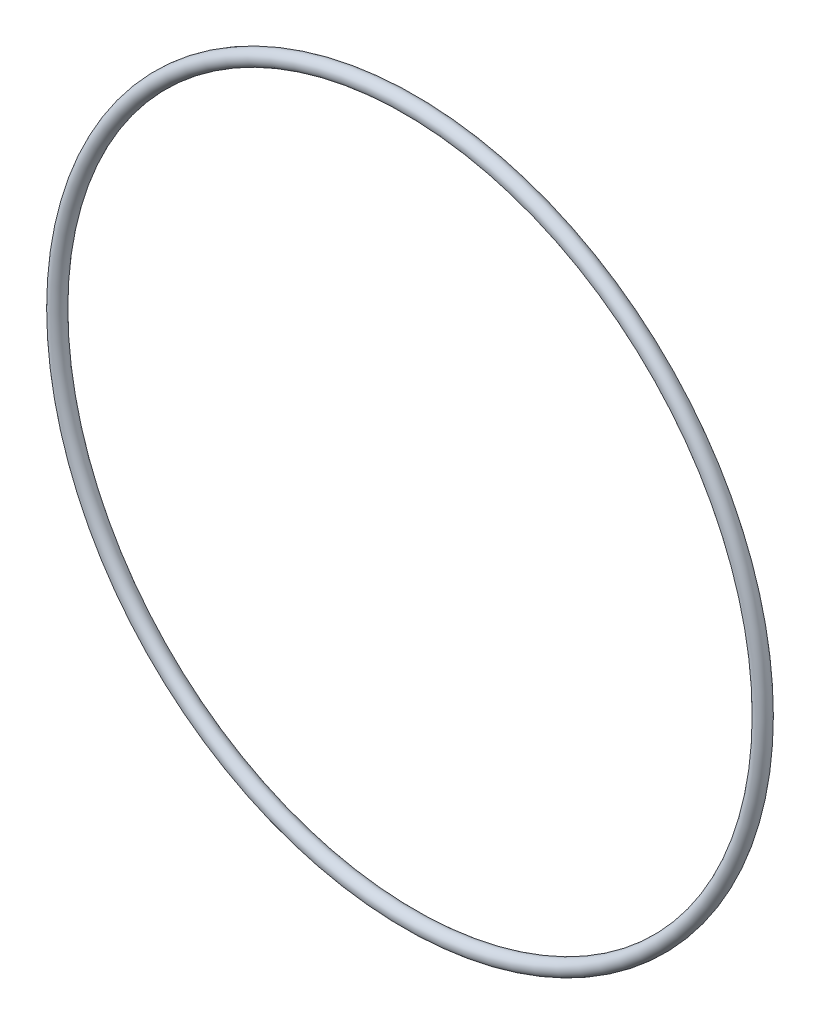
ISO-10303-21;
HEADER;
FILE_DESCRIPTION(('STEP AP214'),'2;1');
FILE_NAME('part.step','',(''),(''),'','','');
FILE_SCHEMA(('AUTOMOTIVE_DESIGN { 1 0 10303 214 1 1 1 1 }'));
ENDSEC;
DATA;
#1=APPLICATION_CONTEXT('core data for automotive mechanical design processes');
#2=APPLICATION_PROTOCOL_DEFINITION('international standard','automotive_design',2000,#1);
#3=PRODUCT_CONTEXT('',#1,'mechanical');
#4=PRODUCT('Part','Part','',(#3));
#5=PRODUCT_RELATED_PRODUCT_CATEGORY('part','',(#4));
#6=PRODUCT_DEFINITION_FORMATION('','',#4);
#7=PRODUCT_DEFINITION_CONTEXT('part definition',#1,'design');
#8=PRODUCT_DEFINITION('design','',#6,#7);
#9=PRODUCT_DEFINITION_SHAPE('','',#8);
#10=(LENGTH_UNIT() NAMED_UNIT(*) SI_UNIT(.MILLI.,.METRE.));
#11=(NAMED_UNIT(*) PLANE_ANGLE_UNIT() SI_UNIT($,.RADIAN.));
#12=(NAMED_UNIT(*) SI_UNIT($,.STERADIAN.) SOLID_ANGLE_UNIT());
#13=UNCERTAINTY_MEASURE_WITH_UNIT(LENGTH_MEASURE(1.E-05),#10,'distance_accuracy_value','');
#14=(GEOMETRIC_REPRESENTATION_CONTEXT(3) GLOBAL_UNCERTAINTY_ASSIGNED_CONTEXT((#13)) GLOBAL_UNIT_ASSIGNED_CONTEXT((#10,
#11,#12)) REPRESENTATION_CONTEXT('',''));
#15=CARTESIAN_POINT('',(0.,0.,0.));
#16=DIRECTION('',(0.,0.,1.));
#17=DIRECTION('',(1.,0.,0.));
#18=AXIS2_PLACEMENT_3D('',#15,#16,#17);
#19=CARTESIAN_POINT('',(0.,0.,0.));
#20=DIRECTION('',(0.,0.,-1.));
#21=DIRECTION('',(-1.,0.,0.));
#22=AXIS2_PLACEMENT_3D('',#19,#20,#21);
#23=TOROIDAL_SURFACE('',#22,61.468,1.30809999999999);
#24=CARTESIAN_POINT('',(-62.7761,0.,0.));
#25=VERTEX_POINT('',#24);
#26=VERTEX_LOOP('',#25);
#27=FACE_BOUND('',#26,.T.);
#28=ADVANCED_FACE('F35',(#27),#23,.T.);
#29=CLOSED_SHELL('',(#28));
#30=MANIFOLD_SOLID_BREP('B2',#29);
#31=ADVANCED_BREP_SHAPE_REPRESENTATION('',(#18,#30),#14);
#32=SHAPE_DEFINITION_REPRESENTATION(#9,#31);
ENDSEC;
END-ISO-10303-21;
